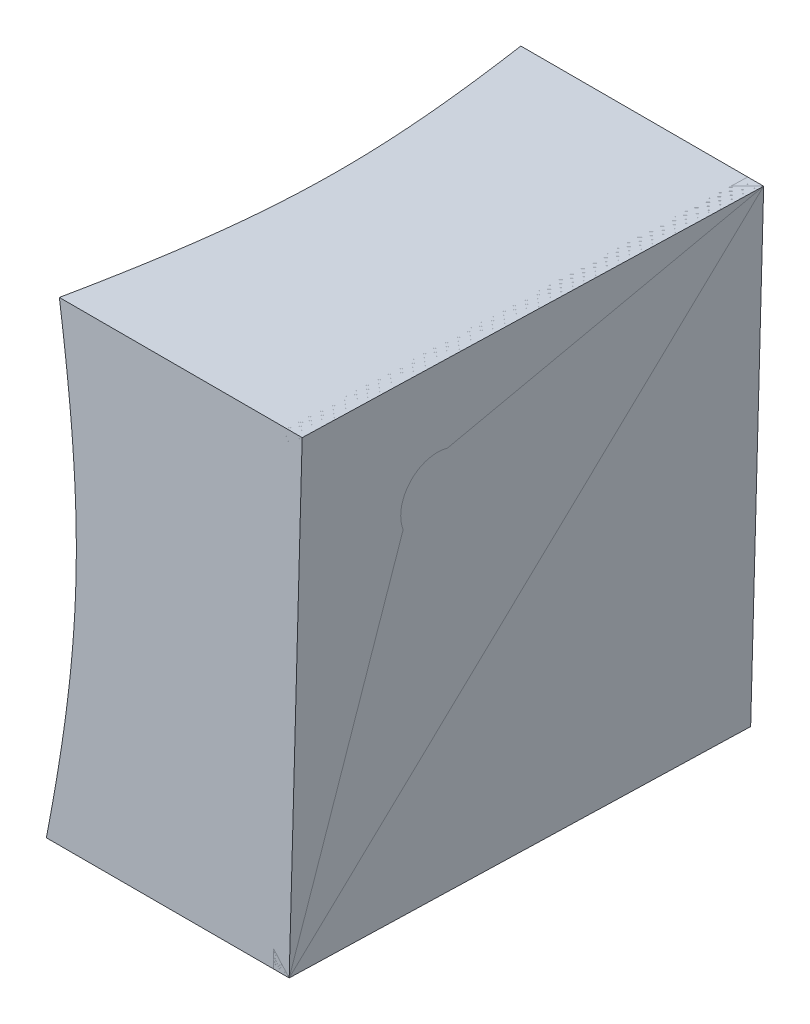
ISO-10303-21;
HEADER;
FILE_DESCRIPTION(('STEP AP214'),'2;1');
FILE_NAME('part.step','',(''),(''),'','','');
FILE_SCHEMA(('AUTOMOTIVE_DESIGN { 1 0 10303 214 1 1 1 1 }'));
ENDSEC;
DATA;
#1=APPLICATION_CONTEXT('core data for automotive mechanical design processes');
#2=APPLICATION_PROTOCOL_DEFINITION('international standard','automotive_design',2000,#1);
#3=PRODUCT_CONTEXT('',#1,'mechanical');
#4=PRODUCT('Part','Part','',(#3));
#5=PRODUCT_RELATED_PRODUCT_CATEGORY('part','',(#4));
#6=PRODUCT_DEFINITION_FORMATION('','',#4);
#7=PRODUCT_DEFINITION_CONTEXT('part definition',#1,'design');
#8=PRODUCT_DEFINITION('design','',#6,#7);
#9=PRODUCT_DEFINITION_SHAPE('','',#8);
#10=(LENGTH_UNIT() NAMED_UNIT(*) SI_UNIT(.MILLI.,.METRE.));
#11=(NAMED_UNIT(*) PLANE_ANGLE_UNIT() SI_UNIT($,.RADIAN.));
#12=(NAMED_UNIT(*) SI_UNIT($,.STERADIAN.) SOLID_ANGLE_UNIT());
#13=UNCERTAINTY_MEASURE_WITH_UNIT(LENGTH_MEASURE(1.E-05),#10,'distance_accuracy_value','');
#14=(GEOMETRIC_REPRESENTATION_CONTEXT(3) GLOBAL_UNCERTAINTY_ASSIGNED_CONTEXT((#13)) GLOBAL_UNIT_ASSIGNED_CONTEXT((#10,
#11,#12)) REPRESENTATION_CONTEXT('',''));
#15=CARTESIAN_POINT('',(0.,0.,0.));
#16=DIRECTION('',(0.,0.,1.));
#17=DIRECTION('',(1.,0.,0.));
#18=AXIS2_PLACEMENT_3D('',#15,#16,#17);
#19=CARTESIAN_POINT('',(-25.61,-22.248377411672,-21.0397546456181));
#20=DIRECTION('',(-1.,0.,0.));
#21=DIRECTION('',(0.,0.,1.));
#22=AXIS2_PLACEMENT_3D('',#19,#20,#21);
#23=CONICAL_SURFACE('',#22,29.,1.33394756584798);
#24=CARTESIAN_POINT('',(-21.1789920651224,-22.248377411672,-21.0397546456181));
#25=DIRECTION('',(-1.,0.,0.));
#26=DIRECTION('',(0.,0.,1.));
#27=AXIS2_PLACEMENT_3D('',#24,#25,#26);
#28=CIRCLE('',#27,10.6429671269357);
#29=CARTESIAN_POINT('',(-21.1789920651224,-22.248377411672,-10.3967875186824));
#30=VERTEX_POINT('',#29);
#31=EDGE_CURVE('E12',#30,#30,#28,.F.);
#32=ORIENTED_EDGE('',*,*,#31,.T.);
#33=EDGE_LOOP('',(#32));
#34=FACE_BOUND('',#33,.T.);
#35=CARTESIAN_POINT('',(-28.5095290864061,-50.420333833359,8.76548777946175));
#36=CARTESIAN_POINT('',(-28.3615120189373,-49.5533192105682,8.74105996271852));
#37=CARTESIAN_POINT('',(-28.2166725597,-48.6857525699901,8.71661659307804));
#38=CARTESIAN_POINT('',(-27.9344218695929,-46.9493810106497,8.66769496576661));
#39=CARTESIAN_POINT('',(-27.7970109167125,-46.0805760467939,8.64321670682519));
#40=CARTESIAN_POINT('',(-27.5306322784443,-44.3412065444453,8.59421061357687));
#41=CARTESIAN_POINT('',(-27.4016690184003,-43.4706413261291,8.56968276011622));
#42=CARTESIAN_POINT('',(-27.1535275015908,-41.7281219349922,8.52058791991479));
#43=CARTESIAN_POINT('',(-27.034349156175,-40.8561677748282,8.49602093353061));
#44=CARTESIAN_POINT('',(-26.8070554140274,-39.1099534307571,8.44682198939508));
#45=CARTESIAN_POINT('',(-26.6989508607805,-38.2356918304129,8.42218999173614));
#46=CARTESIAN_POINT('',(-26.4954430895225,-36.4856747589599,8.37288390716127));
#47=CARTESIAN_POINT('',(-26.4000400225253,-35.609919270215,8.34820981974844));
#48=CARTESIAN_POINT('',(-26.2235172089076,-33.8570926198621,8.29882457632585));
#49=CARTESIAN_POINT('',(-26.1423953660181,-32.9800216704369,8.27411342629425));
#50=CARTESIAN_POINT('',(-25.9959661704289,-31.2245756977996,8.22465438443381));
#51=CARTESIAN_POINT('',(-25.9306584035643,-30.3462007093461,8.19990649358427));
#52=CARTESIAN_POINT('',(-25.8179691541409,-28.5991859282428,8.15068499743102));
#53=CARTESIAN_POINT('',(-25.7703762731965,-27.7305598556457,8.12621177868473));
#54=CARTESIAN_POINT('',(-25.6931071834216,-25.9925067195989,8.07724277357074));
#55=CARTESIAN_POINT('',(-25.6634309447749,-25.1230796574847,8.05274698724067));
#56=CARTESIAN_POINT('',(-25.6227405676756,-23.3837759019233,8.0037427463838));
#57=CARTESIAN_POINT('',(-25.611726637473,-22.5138992035671,7.9792342917187));
#58=CARTESIAN_POINT('',(-25.6086490462998,-20.774112940722,7.93021645639734));
#59=CARTESIAN_POINT('',(-25.616585364688,-19.90420337627,7.90570707574212));
#60=CARTESIAN_POINT('',(-25.6511860596537,-18.1654805771054,7.85671920311714));
#61=CARTESIAN_POINT('',(-25.6778349183791,-17.2966670311303,7.83224070237767));
#62=CARTESIAN_POINT('',(-25.7491698861546,-15.5597813464223,7.78330458977393));
#63=CARTESIAN_POINT('',(-25.7938560930921,-14.6917092117386,7.75884697802373));
#64=CARTESIAN_POINT('',(-25.9002067407894,-12.956622360095,7.70996154687713));
#65=CARTESIAN_POINT('',(-25.961870998212,-12.0896076318182,7.68553372716187));
#66=CARTESIAN_POINT('',(-26.1008527747968,-10.3568322122462,7.63671341976009));
#67=CARTESIAN_POINT('',(-26.1781704302152,-9.49107153193292,7.61232093238299));
#68=CARTESIAN_POINT('',(-26.3285324181474,-7.95006618876275,7.56890367604869));
#69=CARTESIAN_POINT('',(-26.3988156007163,-7.27454974925753,7.5498712498848));
#70=CARTESIAN_POINT('',(-26.5473173293966,-5.92443325905969,7.51183221647334));
#71=CARTESIAN_POINT('',(-26.625535405659,-5.24983315650227,7.49282560776449));
#72=CARTESIAN_POINT('',(-26.8710401613971,-3.22719997339546,7.43583866494146));
#73=CARTESIAN_POINT('',(-27.0491636728229,-1.88047138809848,7.39789508449917));
#74=CARTESIAN_POINT('',(-27.3345557694149,0.140619093372598,7.34095160672489));
#75=CARTESIAN_POINT('',(-27.4330029283504,0.816253373573036,7.32191586044295));
#76=CARTESIAN_POINT('',(-27.6352741600994,2.16671936948047,7.28386697983721));
#77=CARTESIAN_POINT('',(-27.739098225591,2.84155108627906,7.26485384548267));
#78=CARTESIAN_POINT('',(-27.9515363580887,4.19024344984259,7.22685493631309));
#79=CARTESIAN_POINT('',(-28.0601489294023,4.86410433288063,7.20786915484115));
#80=CARTESIAN_POINT('',(-28.2817087806571,6.21110705670203,7.16991785064719));
#81=CARTESIAN_POINT('',(-28.3946560157991,6.88424890484283,7.15095232771789));
#82=CARTESIAN_POINT('',(-28.5095290864061,7.55705937848181,7.13199614114277));
#83=B_SPLINE_CURVE_WITH_KNOTS('',3,(#35,#36,#37,#38,#39,#40,#41,#42,#43,#44,#45,#46,#47,#48,#49,
#50,#51,#52,#53,#54,#55,#56,#57,#58,#59,#60,#61,#62,#63,#64,#65,#66,#67,#68,#69,#70,#71,#72,#73,
#74,#75,#76,#77,#78,#79,#80,#81,#82),.UNSPECIFIED.,.F.,.F.,(4,2,2,2,2,2,2,2,2,2,2,2,2,2,2,2,2,2,
2,2,2,2,2,4),(0.,2.63970211740469,5.2795029493581,7.92067576715604,10.5618246535933,
13.205535522218,15.8492778203558,18.4926317327186,21.1359164091373,23.7465614329058,
26.357202112124,28.9678719228976,31.5785388900533,34.1870434478219,36.7955621619664,
39.4040527091926,42.0125659631853,44.0508052270482,46.0889238709622,50.1655753856931,
52.2146650704377,54.2637519649559,56.3122032987129,58.3606334672046),.UNSPECIFIED.);
#84=CARTESIAN_POINT('',(-28.5094949366117,-50.420133833359,8.76548214453563));
#85=VERTEX_POINT('',#84);
#86=CARTESIAN_POINT('',(-28.5094949366117,7.5568593784818,7.13200177606889));
#87=VERTEX_POINT('',#86);
#88=EDGE_CURVE('E145',#85,#87,#83,.T.);
#89=ORIENTED_EDGE('',*,*,#88,.T.);
#90=CARTESIAN_POINT('',(-28.5095290864061,7.55686501340793,7.13220177606889));
#91=CARTESIAN_POINT('',(-28.3615120189373,7.5324371966647,6.26518715327807));
#92=CARTESIAN_POINT('',(-28.2166725597,7.50799382702421,5.39762051269999));
#93=CARTESIAN_POINT('',(-27.9344218695929,7.45907219971279,3.6612489533596));
#94=CARTESIAN_POINT('',(-27.7970109167125,7.43459394077136,2.79244398950379));
#95=CARTESIAN_POINT('',(-27.5306322784443,7.38558784752305,1.0530744871552));
#96=CARTESIAN_POINT('',(-27.4016690184003,7.36105999406239,0.182509268838954));
#97=CARTESIAN_POINT('',(-27.1535275015908,7.31196515386096,-1.56001012229793));
#98=CARTESIAN_POINT('',(-27.034349156175,7.28739816747679,-2.43196428246194));
#99=CARTESIAN_POINT('',(-26.8070554140274,7.23819922334126,-4.17817862653304));
#100=CARTESIAN_POINT('',(-26.6989508607805,7.21356722568232,-5.05244022687725));
#101=CARTESIAN_POINT('',(-26.4954430895225,7.16426114110744,-6.80245729833022));
#102=CARTESIAN_POINT('',(-26.4000400225253,7.13958705369461,-7.67821278707517));
#103=CARTESIAN_POINT('',(-26.2235172089076,7.09020181027202,-9.431039437428));
#104=CARTESIAN_POINT('',(-26.1423953660182,7.06549066024043,-10.3081103868532));
#105=CARTESIAN_POINT('',(-25.9959661704289,7.01603161837999,-12.0635563594905));
#106=CARTESIAN_POINT('',(-25.9306584035643,6.99128372753045,-12.941931347944));
#107=CARTESIAN_POINT('',(-25.8179691541409,6.9420622313772,-14.6889461290473));
#108=CARTESIAN_POINT('',(-25.7703762731965,6.91758901263091,-15.5575722016444));
#109=CARTESIAN_POINT('',(-25.6931071834216,6.86862000751692,-17.2956253376912));
#110=CARTESIAN_POINT('',(-25.6634309447749,6.84412422118684,-18.1650523998055));
#111=CARTESIAN_POINT('',(-25.6227405676756,6.79511998032998,-19.9043561553668));
#112=CARTESIAN_POINT('',(-25.611726637473,6.77061152566487,-20.774232853723));
#113=CARTESIAN_POINT('',(-25.6086490462998,6.72159369034351,-22.5140191165681));
#114=CARTESIAN_POINT('',(-25.616585364688,6.6970843096883,-23.3839286810201));
#115=CARTESIAN_POINT('',(-25.6511860596537,6.64809643706332,-25.1226514801848));
#116=CARTESIAN_POINT('',(-25.6778349183791,6.62361793632385,-25.9914650261598));
#117=CARTESIAN_POINT('',(-25.7491698861546,6.5746818237201,-27.7283507108678));
#118=CARTESIAN_POINT('',(-25.7938560930921,6.55022421196991,-28.5964228455515));
#119=CARTESIAN_POINT('',(-25.9002067407894,6.5013387808233,-30.3315096971951));
#120=CARTESIAN_POINT('',(-25.961870998212,6.47691096110804,-31.1985244254719));
#121=CARTESIAN_POINT('',(-26.1008527747968,6.42809065370627,-32.931299845044));
#122=CARTESIAN_POINT('',(-26.1781704302152,6.40369816632917,-33.7970605253572));
#123=CARTESIAN_POINT('',(-26.3285324181474,6.36028090999486,-35.3380658685274));
#124=CARTESIAN_POINT('',(-26.3988156007163,6.34124848383098,-36.0135823080326));
#125=CARTESIAN_POINT('',(-26.5473173293966,6.30320945041952,-37.3636987982304));
#126=CARTESIAN_POINT('',(-26.625535405659,6.28420284171066,-38.0382989007878));
#127=CARTESIAN_POINT('',(-26.8710401613971,6.22721589888763,-40.0609320838947));
#128=CARTESIAN_POINT('',(-27.0491636728229,6.18927231844534,-41.4076606691916));
#129=CARTESIAN_POINT('',(-27.3345557694149,6.13232884067107,-43.4287511506627));
#130=CARTESIAN_POINT('',(-27.4330029283504,6.11329309438912,-44.1043854308631));
#131=CARTESIAN_POINT('',(-27.6352741600994,6.07524421378339,-45.4548514267706));
#132=CARTESIAN_POINT('',(-27.739098225591,6.05623107942885,-46.1296831435692));
#133=CARTESIAN_POINT('',(-27.9515363580887,6.01823217025927,-47.4783755071327));
#134=CARTESIAN_POINT('',(-28.0601489294023,5.99924638878733,-48.1522363901707));
#135=CARTESIAN_POINT('',(-28.2817087806571,5.96129508459337,-49.4992391139921));
#136=CARTESIAN_POINT('',(-28.3946560157991,5.94232956166406,-50.1723809621329));
#137=CARTESIAN_POINT('',(-28.5095290864061,5.92337337508894,-50.8451914357719));
#138=B_SPLINE_CURVE_WITH_KNOTS('',3,(#90,#91,#92,#93,#94,#95,#96,#97,#98,#99,#100,#101,#102,
#103,#104,#105,#106,#107,#108,#109,#110,#111,#112,#113,#114,#115,#116,#117,#118,#119,#120,#121,
#122,#123,#124,#125,#126,#127,#128,#129,#130,#131,#132,#133,#134,#135,#136,#137),.UNSPECIFIED.,
.F.,.F.,(4,2,2,2,2,2,2,2,2,2,2,2,2,2,2,2,2,2,2,2,2,2,2,4),(0.,2.63970211740469,5.2795029493581,
7.92067576715604,10.5618246535933,13.205535522218,15.8492778203558,18.4926317327186,
21.1359164091373,23.7465614329058,26.357202112124,28.9678719228976,31.5785388900533,
34.1870434478219,36.7955621619664,39.4040527091926,42.0125659631852,44.0508052270482,
46.0889238709622,50.1655753856931,52.2146650704377,54.2637519649559,56.3122032987128,
58.3606334672046),.UNSPECIFIED.);
#139=CARTESIAN_POINT('',(-28.5094949366117,5.92337901001507,-50.8449914357719));
#140=VERTEX_POINT('',#139);
#141=EDGE_CURVE('E170',#87,#140,#138,.T.);
#142=ORIENTED_EDGE('',*,*,#141,.T.);
#143=CARTESIAN_POINT('',(-28.5095290864061,5.92357901001507,-50.844997070698));
#144=CARTESIAN_POINT('',(-28.3615120189373,5.05656438722425,-50.8205692539548));
#145=CARTESIAN_POINT('',(-28.2166725597,4.18899774664617,-50.7961258843143));
#146=CARTESIAN_POINT('',(-27.9344218695929,2.45262618730578,-50.7472042570029));
#147=CARTESIAN_POINT('',(-27.7970109167125,1.58382122344997,-50.7227259980615));
#148=CARTESIAN_POINT('',(-27.5306322784443,-0.155548278898622,-50.6737199048131));
#149=CARTESIAN_POINT('',(-27.4016690184003,-1.02611349721487,-50.6491920513525));
#150=CARTESIAN_POINT('',(-27.1535275015908,-2.76863288835175,-50.6000972111511));
#151=CARTESIAN_POINT('',(-27.034349156175,-3.64058704851576,-50.5755302247669));
#152=CARTESIAN_POINT('',(-26.8070554140274,-5.38680139258686,-50.5263312806314));
#153=CARTESIAN_POINT('',(-26.6989508607805,-6.26106299293107,-50.5016992829724));
#154=CARTESIAN_POINT('',(-26.4954430895225,-8.01108006438404,-50.4523931983975));
#155=CARTESIAN_POINT('',(-26.4000400225253,-8.88683555312898,-50.4277191109847));
#156=CARTESIAN_POINT('',(-26.2235172089076,-10.6396622034818,-50.3783338675621));
#157=CARTESIAN_POINT('',(-26.1423953660181,-11.516733152907,-50.3536227175305));
#158=CARTESIAN_POINT('',(-25.9959661704289,-13.2721791255443,-50.3041636756701));
#159=CARTESIAN_POINT('',(-25.9306584035643,-14.1505541139978,-50.2794157848206));
#160=CARTESIAN_POINT('',(-25.8179691541409,-15.8975688951011,-50.2301942886673));
#161=CARTESIAN_POINT('',(-25.7703762731965,-16.7661949676982,-50.205721069921));
#162=CARTESIAN_POINT('',(-25.6931071834216,-18.504248103745,-50.156752064807));
#163=CARTESIAN_POINT('',(-25.6634309447749,-19.3736751658593,-50.132256278477));
#164=CARTESIAN_POINT('',(-25.6227405676756,-21.1129789214207,-50.0832520376201));
#165=CARTESIAN_POINT('',(-25.611726637473,-21.9828556197768,-50.058743582955));
#166=CARTESIAN_POINT('',(-25.6086490462998,-23.7226418826219,-50.0097257476336));
#167=CARTESIAN_POINT('',(-25.616585364688,-24.5925514470739,-49.9852163669784));
#168=CARTESIAN_POINT('',(-25.6511860596537,-26.3312742462386,-49.9362284943534));
#169=CARTESIAN_POINT('',(-25.6778349183791,-27.2000877922136,-49.911749993614));
#170=CARTESIAN_POINT('',(-25.7491698861546,-28.9369734769216,-49.8628138810102));
#171=CARTESIAN_POINT('',(-25.7938560930921,-29.8050456116053,-49.83835626926));
#172=CARTESIAN_POINT('',(-25.9002067407894,-31.5401324632489,-49.7894708381134));
#173=CARTESIAN_POINT('',(-25.961870998212,-32.4071471915257,-49.7650430183981));
#174=CARTESIAN_POINT('',(-26.1008527747968,-34.1399226110978,-49.7162227109964));
#175=CARTESIAN_POINT('',(-26.1781704302152,-35.005683291411,-49.6918302236193));
#176=CARTESIAN_POINT('',(-26.3285324181474,-36.5466886345812,-49.648412967285));
#177=CARTESIAN_POINT('',(-26.3988156007163,-37.2222050740864,-49.6293805411211));
#178=CARTESIAN_POINT('',(-26.5473173293966,-38.5723215642843,-49.5913415077096));
#179=CARTESIAN_POINT('',(-26.625535405659,-39.2469216668417,-49.5723348990008));
#180=CARTESIAN_POINT('',(-26.8710401613971,-41.2695548499485,-49.5153479561777));
#181=CARTESIAN_POINT('',(-27.0491636728229,-42.6162834352455,-49.4774043757355));
#182=CARTESIAN_POINT('',(-27.3345557694149,-44.6373739167165,-49.4204608979612));
#183=CARTESIAN_POINT('',(-27.4330029283504,-45.313008196917,-49.4014251516792));
#184=CARTESIAN_POINT('',(-27.6352741600994,-46.6634741928244,-49.3633762710735));
#185=CARTESIAN_POINT('',(-27.739098225591,-47.338305909623,-49.344363136719));
#186=CARTESIAN_POINT('',(-27.9515363580887,-48.6869982731865,-49.3063642275494));
#187=CARTESIAN_POINT('',(-28.0601489294023,-49.3608591562246,-49.2873784460774));
#188=CARTESIAN_POINT('',(-28.2817087806571,-50.707861880046,-49.2494271418835));
#189=CARTESIAN_POINT('',(-28.3946560157991,-51.3810037281868,-49.2304616189542));
#190=CARTESIAN_POINT('',(-28.5095290864061,-52.0538142018258,-49.211505432379));
#191=B_SPLINE_CURVE_WITH_KNOTS('',3,(#143,#144,#145,#146,#147,#148,#149,#150,#151,#152,#153,
#154,#155,#156,#157,#158,#159,#160,#161,#162,#163,#164,#165,#166,#167,#168,#169,#170,#171,#172,
#173,#174,#175,#176,#177,#178,#179,#180,#181,#182,#183,#184,#185,#186,#187,#188,#189,#190),
.UNSPECIFIED.,.F.,.F.,(4,2,2,2,2,2,2,2,2,2,2,2,2,2,2,2,2,2,2,2,2,2,2,4),(0.,2.63970211740469,
5.2795029493581,7.92067576715603,10.5618246535933,13.205535522218,15.8492778203558,
18.4926317327186,21.1359164091373,23.7465614329058,26.357202112124,28.9678719228976,
31.5785388900533,34.1870434478218,36.7955621619664,39.4040527091926,42.0125659631852,
44.0508052270482,46.0889238709622,50.1655753856931,52.2146650704377,54.2637519649559,
56.3122032987129,58.3606334672046),.UNSPECIFIED.);
#192=CARTESIAN_POINT('',(-28.5094949366117,-52.0536142018258,-49.2115110673052));
#193=VERTEX_POINT('',#192);
#194=EDGE_CURVE('E178',#140,#193,#191,.T.);
#195=ORIENTED_EDGE('',*,*,#194,.T.);
#196=CARTESIAN_POINT('',(-28.5095290864061,-52.0536198367519,-49.2117110673052));
#197=CARTESIAN_POINT('',(-28.3615120189373,-52.0291920200087,-48.3446964445144));
#198=CARTESIAN_POINT('',(-28.2166725597,-52.0047486503682,-47.4771298039363));
#199=CARTESIAN_POINT('',(-27.9344218695929,-51.9558270230567,-45.7407582445959));
#200=CARTESIAN_POINT('',(-27.7970109167125,-51.9313487641153,-44.8719532807401));
#201=CARTESIAN_POINT('',(-27.5306322784443,-51.882342670867,-43.1325837783915));
#202=CARTESIAN_POINT('',(-27.4016690184003,-51.8578148174063,-42.2620185600752));
#203=CARTESIAN_POINT('',(-27.1535275015908,-51.8087199772049,-40.5194991689384));
#204=CARTESIAN_POINT('',(-27.034349156175,-51.7841529908207,-39.6475450087743));
#205=CARTESIAN_POINT('',(-26.8070554140274,-51.7349540466852,-37.9013306647032));
#206=CARTESIAN_POINT('',(-26.6989508607805,-51.7103220490263,-37.027069064359));
#207=CARTESIAN_POINT('',(-26.4954430895225,-51.6610159644514,-35.2770519929061));
#208=CARTESIAN_POINT('',(-26.4000400225253,-51.6363418770386,-34.4012965041611));
#209=CARTESIAN_POINT('',(-26.2235172089076,-51.586956633616,-32.6484698538083));
#210=CARTESIAN_POINT('',(-26.1423953660181,-51.5622454835844,-31.7713989043831));
#211=CARTESIAN_POINT('',(-25.9959661704289,-51.5127864417239,-30.0159529317458));
#212=CARTESIAN_POINT('',(-25.9306584035643,-51.4880385508744,-29.1375779432923));
#213=CARTESIAN_POINT('',(-25.8179691541409,-51.4388170547211,-27.390563162189));
#214=CARTESIAN_POINT('',(-25.7703762731965,-51.4143438359749,-26.5219370895919));
#215=CARTESIAN_POINT('',(-25.6931071834216,-51.3653748308609,-24.7838839535451));
#216=CARTESIAN_POINT('',(-25.6634309447749,-51.3408790445308,-23.9144568914308));
#217=CARTESIAN_POINT('',(-25.6227405676756,-51.2918748036739,-22.1751531358694));
#218=CARTESIAN_POINT('',(-25.611726637473,-51.2673663490088,-21.3052764375133));
#219=CARTESIAN_POINT('',(-25.6086490462998,-51.2183485136875,-19.5654901746682));
#220=CARTESIAN_POINT('',(-25.616585364688,-51.1938391330322,-18.6955806102162));
#221=CARTESIAN_POINT('',(-25.6511860596537,-51.1448512604073,-16.9568578110515));
#222=CARTESIAN_POINT('',(-25.6778349183791,-51.1203727596678,-16.0880442650765));
#223=CARTESIAN_POINT('',(-25.7491698861546,-51.0714366470641,-14.3511585803685));
#224=CARTESIAN_POINT('',(-25.7938560930921,-51.0469790353139,-13.4830864456848));
#225=CARTESIAN_POINT('',(-25.9002067407894,-50.9980936041673,-11.7479995940412));
#226=CARTESIAN_POINT('',(-25.961870998212,-50.973665784452,-10.8809848657644));
#227=CARTESIAN_POINT('',(-26.1008527747968,-50.9248454770502,-9.14820944619234));
#228=CARTESIAN_POINT('',(-26.1781704302152,-50.9004529896731,-8.28244876587909));
#229=CARTESIAN_POINT('',(-26.3285324181474,-50.8570357333388,-6.74144342270892));
#230=CARTESIAN_POINT('',(-26.3988156007163,-50.8380033071749,-6.0659269832037));
#231=CARTESIAN_POINT('',(-26.5473173293966,-50.7999642737635,-4.71581049300585));
#232=CARTESIAN_POINT('',(-26.625535405659,-50.7809576650546,-4.04121039044844));
#233=CARTESIAN_POINT('',(-26.8710401613971,-50.7239707222316,-2.01857720734163));
#234=CARTESIAN_POINT('',(-27.0491636728229,-50.6860271417893,-0.671848622044654));
#235=CARTESIAN_POINT('',(-27.3345557694149,-50.629083664015,1.34924185942642));
#236=CARTESIAN_POINT('',(-27.4330029283504,-50.6100479177331,2.02487613962686));
#237=CARTESIAN_POINT('',(-27.6352741600994,-50.5719990371273,3.37534213553429));
#238=CARTESIAN_POINT('',(-27.739098225591,-50.5529859027728,4.05017385233288));
#239=CARTESIAN_POINT('',(-27.9515363580887,-50.5149869936032,5.39886621589641));
#240=CARTESIAN_POINT('',(-28.0601489294023,-50.4960012121313,6.07272709893445));
#241=CARTESIAN_POINT('',(-28.2817087806571,-50.4580499079373,7.41972982275585));
#242=CARTESIAN_POINT('',(-28.3946560157991,-50.439084385008,8.09287167089666));
#243=CARTESIAN_POINT('',(-28.5095290864061,-50.4201281984329,8.76568214453563));
#244=B_SPLINE_CURVE_WITH_KNOTS('',3,(#196,#197,#198,#199,#200,#201,#202,#203,#204,#205,#206,
#207,#208,#209,#210,#211,#212,#213,#214,#215,#216,#217,#218,#219,#220,#221,#222,#223,#224,#225,
#226,#227,#228,#229,#230,#231,#232,#233,#234,#235,#236,#237,#238,#239,#240,#241,#242,#243),
.UNSPECIFIED.,.F.,.F.,(4,2,2,2,2,2,2,2,2,2,2,2,2,2,2,2,2,2,2,2,2,2,2,4),(0.,2.63970211740469,
5.2795029493581,7.92067576715603,10.5618246535933,13.205535522218,15.8492778203558,
18.4926317327186,21.1359164091373,23.7465614329058,26.357202112124,28.9678719228976,
31.5785388900533,34.1870434478218,36.7955621619664,39.4040527091926,42.0125659631852,
44.0508052270482,46.0889238709622,50.1655753856931,52.2146650704377,54.2637519649559,
56.3122032987129,58.3606334672046),.UNSPECIFIED.);
#245=EDGE_CURVE('E123',#193,#85,#244,.T.);
#246=ORIENTED_EDGE('',*,*,#245,.T.);
#247=EDGE_LOOP('',(#89,#142,#195,#246));
#248=FACE_BOUND('',#247,.T.);
#249=ADVANCED_FACE('F51',(#34,#248),#23,.F.);
#250=CARTESIAN_POINT('',(-18.61,-52.0536142018258,-49.2115110673052));
#251=DIRECTION('',(0.,0.999603331238634,-0.0281634546287368));
#252=DIRECTION('',(0.,0.0281634546287368,0.999603331238634));
#253=AXIS2_PLACEMENT_3D('',#250,#251,#252);
#254=PLANE('',#253);
#255=DIRECTION('',(1.,0.,0.));
#256=VECTOR('',#255,1.);
#257=CARTESIAN_POINT('',(-18.61,-52.0536142018258,-49.2115110673052));
#258=LINE('',#257,#256);
#259=CARTESIAN_POINT('',(2.,-52.0536142018258,-49.2115110673052));
#260=VERTEX_POINT('',#259);
#261=EDGE_CURVE('E117',#193,#260,#258,.T.);
#262=ORIENTED_EDGE('',*,*,#261,.T.);
#263=DIRECTION('',(0.,-0.0281634546287368,-0.999603331238634));
#264=VECTOR('',#263,1.);
#265=CARTESIAN_POINT('',(2.,-52.0536142018258,-49.2115110673052));
#266=LINE('',#265,#264);
#267=CARTESIAN_POINT('',(2.,-50.420133833359,8.76548214453563));
#268=VERTEX_POINT('',#267);
#269=EDGE_CURVE('E121',#268,#260,#266,.T.);
#270=ORIENTED_EDGE('',*,*,#269,.F.);
#271=DIRECTION('',(1.,0.,0.));
#272=VECTOR('',#271,1.);
#273=CARTESIAN_POINT('',(-18.61,-50.420133833359,8.76548214453563));
#274=LINE('',#273,#272);
#275=EDGE_CURVE('E217',#85,#268,#274,.T.);
#276=ORIENTED_EDGE('',*,*,#275,.F.);
#277=ORIENTED_EDGE('',*,*,#245,.F.);
#278=EDGE_LOOP('',(#262,#270,#276,#277));
#279=FACE_BOUND('',#278,.T.);
#280=ADVANCED_FACE('F119',(#279),#254,.F.);
#281=CARTESIAN_POINT('',(-18.61,-50.420133833359,8.76548214453563));
#282=DIRECTION('',(0.,-0.0281634546287368,-0.999603331238634));
#283=DIRECTION('',(0.,0.999603331238634,-0.0281634546287368));
#284=AXIS2_PLACEMENT_3D('',#281,#282,#283);
#285=PLANE('',#284);
#286=ORIENTED_EDGE('',*,*,#275,.T.);
#287=DIRECTION('',(0.,-0.999603331238634,0.0281634546287368));
#288=VECTOR('',#287,1.);
#289=CARTESIAN_POINT('',(2.,-50.420133833359,8.76548214453563));
#290=LINE('',#289,#288);
#291=CARTESIAN_POINT('',(2.,7.5568593784818,7.13200177606889));
#292=VERTEX_POINT('',#291);
#293=EDGE_CURVE('E140',#292,#268,#290,.T.);
#294=ORIENTED_EDGE('',*,*,#293,.F.);
#295=DIRECTION('',(1.,0.,0.));
#296=VECTOR('',#295,1.);
#297=CARTESIAN_POINT('',(-18.61,7.5568593784818,7.13200177606889));
#298=LINE('',#297,#296);
#299=EDGE_CURVE('E66',#87,#292,#298,.T.);
#300=ORIENTED_EDGE('',*,*,#299,.F.);
#301=ORIENTED_EDGE('',*,*,#88,.F.);
#302=EDGE_LOOP('',(#286,#294,#300,#301));
#303=FACE_BOUND('',#302,.T.);
#304=ADVANCED_FACE('F251',(#303),#285,.F.);
#305=CARTESIAN_POINT('',(-18.61,7.5568593784818,7.13200177606889));
#306=DIRECTION('',(0.,-0.999603331238634,0.0281634546287368));
#307=DIRECTION('',(0.,-0.0281634546287368,-0.999603331238634));
#308=AXIS2_PLACEMENT_3D('',#305,#306,#307);
#309=PLANE('',#308);
#310=ORIENTED_EDGE('',*,*,#299,.T.);
#311=DIRECTION('',(0.,0.0281634546287368,0.999603331238634));
#312=VECTOR('',#311,1.);
#313=CARTESIAN_POINT('',(2.,7.5568593784818,7.13200177606889));
#314=LINE('',#313,#312);
#315=CARTESIAN_POINT('',(2.,5.92337901001507,-50.8449914357719));
#316=VERTEX_POINT('',#315);
#317=EDGE_CURVE('E136',#316,#292,#314,.T.);
#318=ORIENTED_EDGE('',*,*,#317,.F.);
#319=DIRECTION('',(1.,0.,0.));
#320=VECTOR('',#319,1.);
#321=CARTESIAN_POINT('',(-18.61,5.92337901001507,-50.8449914357719));
#322=LINE('',#321,#320);
#323=EDGE_CURVE('E127',#140,#316,#322,.T.);
#324=ORIENTED_EDGE('',*,*,#323,.F.);
#325=ORIENTED_EDGE('',*,*,#141,.F.);
#326=EDGE_LOOP('',(#310,#318,#324,#325));
#327=FACE_BOUND('',#326,.T.);
#328=ADVANCED_FACE('F256',(#327),#309,.F.);
#329=CARTESIAN_POINT('',(-18.61,5.92337901001507,-50.8449914357719));
#330=DIRECTION('',(0.,0.0281634546287367,0.999603331238634));
#331=DIRECTION('',(0.,-0.999603331238634,0.0281634546287367));
#332=AXIS2_PLACEMENT_3D('',#329,#330,#331);
#333=PLANE('',#332);
#334=ORIENTED_EDGE('',*,*,#323,.T.);
#335=DIRECTION('',(0.,0.999603331238634,-0.0281634546287367));
#336=VECTOR('',#335,1.);
#337=CARTESIAN_POINT('',(2.,5.92337901001507,-50.8449914357719));
#338=LINE('',#337,#336);
#339=EDGE_CURVE('E131',#260,#316,#338,.T.);
#340=ORIENTED_EDGE('',*,*,#339,.F.);
#341=ORIENTED_EDGE('',*,*,#261,.F.);
#342=ORIENTED_EDGE('',*,*,#194,.F.);
#343=EDGE_LOOP('',(#334,#340,#341,#342));
#344=FACE_BOUND('',#343,.T.);
#345=ADVANCED_FACE('F132',(#344),#333,.F.);
#346=CARTESIAN_POINT('',(-18.61,5.50132580674706,5.1891220228491));
#347=DIRECTION('',(0.,-0.999603331238634,0.0281634546287368));
#348=DIRECTION('',(0.,-0.0281634546287368,-0.999603331238634));
#349=AXIS2_PLACEMENT_3D('',#346,#347,#348);
#350=PLANE('',#349);
#351=DIRECTION('',(0.,-0.0281634546287368,-0.999603331238634));
#352=VECTOR('',#351,1.);
#353=CARTESIAN_POINT('',(0.,5.50132580674706,5.1891220228491));
#354=LINE('',#353,#352);
#355=CARTESIAN_POINT('',(0.,5.50132580674706,5.1891220228491));
#356=VERTEX_POINT('',#355);
#357=CARTESIAN_POINT('',(0.,3.98049925679527,-48.7894578640372));
#358=VERTEX_POINT('',#357);
#359=EDGE_CURVE('E185',#356,#358,#354,.T.);
#360=ORIENTED_EDGE('',*,*,#359,.F.);
#361=DIRECTION('',(1.,0.,0.));
#362=VECTOR('',#361,1.);
#363=CARTESIAN_POINT('',(-18.61,5.50132580674706,5.1891220228491));
#364=LINE('',#363,#362);
#365=CARTESIAN_POINT('',(-18.61,5.50132580674706,5.1891220228491));
#366=VERTEX_POINT('',#365);
#367=EDGE_CURVE('E197',#366,#356,#364,.T.);
#368=ORIENTED_EDGE('',*,*,#367,.F.);
#369=DIRECTION('',(0.,-0.0281634546287368,-0.999603331238634));
#370=VECTOR('',#369,1.);
#371=CARTESIAN_POINT('',(-18.61,5.50132580674706,5.1891220228491));
#372=LINE('',#371,#370);
#373=CARTESIAN_POINT('',(-18.61,3.98049925679527,-48.7894578640372));
#374=VERTEX_POINT('',#373);
#375=EDGE_CURVE('E186',#366,#374,#372,.T.);
#376=ORIENTED_EDGE('',*,*,#375,.T.);
#377=DIRECTION('',(1.,0.,0.));
#378=VECTOR('',#377,1.);
#379=CARTESIAN_POINT('',(-18.61,3.98049925679527,-48.7894578640372));
#380=LINE('',#379,#378);
#381=EDGE_CURVE('E128',#374,#358,#380,.T.);
#382=ORIENTED_EDGE('',*,*,#381,.T.);
#383=EDGE_LOOP('',(#360,#368,#376,#382));
#384=FACE_BOUND('',#383,.T.);
#385=ADVANCED_FACE('F266',(#384),#350,.T.);
#386=CARTESIAN_POINT('',(-18.61,3.98049925679527,-48.7894578640372));
#387=DIRECTION('',(0.,0.0281634546287368,0.999603331238634));
#388=DIRECTION('',(0.,-0.999603331238634,0.0281634546287368));
#389=AXIS2_PLACEMENT_3D('',#386,#387,#388);
#390=PLANE('',#389);
#391=DIRECTION('',(0.,-0.999603331238634,0.0281634546287368));
#392=VECTOR('',#391,1.);
#393=CARTESIAN_POINT('',(0.,3.98049925679527,-48.7894578640372));
#394=LINE('',#393,#392);
#395=CARTESIAN_POINT('',(0.,-49.998080630091,-47.2686313140854));
#396=VERTEX_POINT('',#395);
#397=EDGE_CURVE('E200',#358,#396,#394,.T.);
#398=ORIENTED_EDGE('',*,*,#397,.F.);
#399=ORIENTED_EDGE('',*,*,#381,.F.);
#400=DIRECTION('',(0.,-0.999603331238634,0.0281634546287368));
#401=VECTOR('',#400,1.);
#402=CARTESIAN_POINT('',(-18.61,3.98049925679527,-48.7894578640372));
#403=LINE('',#402,#401);
#404=CARTESIAN_POINT('',(-18.61,-49.998080630091,-47.2686313140854));
#405=VERTEX_POINT('',#404);
#406=EDGE_CURVE('E189',#374,#405,#403,.T.);
#407=ORIENTED_EDGE('',*,*,#406,.T.);
#408=DIRECTION('',(1.,0.,0.));
#409=VECTOR('',#408,1.);
#410=CARTESIAN_POINT('',(-18.61,-49.998080630091,-47.2686313140854));
#411=LINE('',#410,#409);
#412=EDGE_CURVE('E211',#405,#396,#411,.T.);
#413=ORIENTED_EDGE('',*,*,#412,.T.);
#414=EDGE_LOOP('',(#398,#399,#407,#413));
#415=FACE_BOUND('',#414,.T.);
#416=ADVANCED_FACE('F269',(#415),#390,.T.);
#417=CARTESIAN_POINT('',(-18.61,-49.998080630091,-47.2686313140854));
#418=DIRECTION('',(0.,0.999603331238634,-0.028163454628737));
#419=DIRECTION('',(0.,0.028163454628737,0.999603331238634));
#420=AXIS2_PLACEMENT_3D('',#417,#418,#419);
#421=PLANE('',#420);
#422=DIRECTION('',(0.,0.028163454628737,0.999603331238634));
#423=VECTOR('',#422,1.);
#424=CARTESIAN_POINT('',(0.,-49.998080630091,-47.2686313140854));
#425=LINE('',#424,#423);
#426=CARTESIAN_POINT('',(0.,-48.4772540801392,6.70994857280088));
#427=VERTEX_POINT('',#426);
#428=EDGE_CURVE('E203',#396,#427,#425,.T.);
#429=ORIENTED_EDGE('',*,*,#428,.F.);
#430=ORIENTED_EDGE('',*,*,#412,.F.);
#431=DIRECTION('',(0.,0.028163454628737,0.999603331238634));
#432=VECTOR('',#431,1.);
#433=CARTESIAN_POINT('',(-18.61,-49.998080630091,-47.2686313140854));
#434=LINE('',#433,#432);
#435=CARTESIAN_POINT('',(-18.61,-48.4772540801392,6.70994857280088));
#436=VERTEX_POINT('',#435);
#437=EDGE_CURVE('E193',#405,#436,#434,.T.);
#438=ORIENTED_EDGE('',*,*,#437,.T.);
#439=DIRECTION('',(1.,0.,0.));
#440=VECTOR('',#439,1.);
#441=CARTESIAN_POINT('',(-18.61,-48.4772540801392,6.70994857280088));
#442=LINE('',#441,#440);
#443=EDGE_CURVE('E209',#436,#427,#442,.T.);
#444=ORIENTED_EDGE('',*,*,#443,.T.);
#445=EDGE_LOOP('',(#429,#430,#438,#444));
#446=FACE_BOUND('',#445,.T.);
#447=ADVANCED_FACE('F273',(#446),#421,.T.);
#448=CARTESIAN_POINT('',(-18.61,-48.4772540801392,6.70994857280088));
#449=DIRECTION('',(0.,-0.0281634546287368,-0.999603331238634));
#450=DIRECTION('',(0.,0.999603331238634,-0.0281634546287368));
#451=AXIS2_PLACEMENT_3D('',#448,#449,#450);
#452=PLANE('',#451);
#453=DIRECTION('',(0.,0.999603331238634,-0.0281634546287368));
#454=VECTOR('',#453,1.);
#455=CARTESIAN_POINT('',(0.,-48.4772540801392,6.70994857280088));
#456=LINE('',#455,#454);
#457=EDGE_CURVE('E190',#427,#356,#456,.T.);
#458=ORIENTED_EDGE('',*,*,#457,.F.);
#459=ORIENTED_EDGE('',*,*,#443,.F.);
#460=DIRECTION('',(0.,0.999603331238634,-0.0281634546287368));
#461=VECTOR('',#460,1.);
#462=CARTESIAN_POINT('',(-18.61,-48.4772540801392,6.70994857280088));
#463=LINE('',#462,#461);
#464=EDGE_CURVE('E74',#436,#366,#463,.T.);
#465=ORIENTED_EDGE('',*,*,#464,.T.);
#466=ORIENTED_EDGE('',*,*,#367,.T.);
#467=EDGE_LOOP('',(#458,#459,#465,#466));
#468=FACE_BOUND('',#467,.T.);
#469=ADVANCED_FACE('F276',(#468),#452,.T.);
#470=CARTESIAN_POINT('',(-18.61,-51.2368740175924,-20.2230144613848));
#471=DIRECTION('',(1.,0.,0.));
#472=DIRECTION('',(0.,0.,-1.));
#473=AXIS2_PLACEMENT_3D('',#470,#471,#472);
#474=PLANE('',#473);
#475=CARTESIAN_POINT('',(-18.61,-22.248377411672,-21.0397546456181));
#476=DIRECTION('',(1.,0.,0.));
#477=DIRECTION('',(0.,0.,-1.));
#478=AXIS2_PLACEMENT_3D('',#475,#476,#477);
#479=CIRCLE('',#478,6.);
#480=CARTESIAN_POINT('',(-18.61,-22.248377411672,-27.0397546456181));
#481=VERTEX_POINT('',#480);
#482=EDGE_CURVE('E177',#481,#481,#479,.T.);
#483=ORIENTED_EDGE('',*,*,#482,.F.);
#484=EDGE_LOOP('',(#483));
#485=FACE_BOUND('',#484,.T.);
#486=ORIENTED_EDGE('',*,*,#406,.F.);
#487=ORIENTED_EDGE('',*,*,#375,.F.);
#488=ORIENTED_EDGE('',*,*,#464,.F.);
#489=ORIENTED_EDGE('',*,*,#437,.F.);
#490=EDGE_LOOP('',(#486,#487,#488,#489));
#491=FACE_BOUND('',#490,.T.);
#492=ADVANCED_FACE('F168',(#485,#491),#474,.T.);
#493=CARTESIAN_POINT('',(2.,0.,0.));
#494=DIRECTION('',(-1.,0.,0.));
#495=DIRECTION('',(0.,0.,1.));
#496=AXIS2_PLACEMENT_3D('',#493,#494,#495);
#497=PLANE('',#496);
#498=CARTESIAN_POINT('',(2.,-7.13279623081204,-9.84503414650285));
#499=DIRECTION('',(-1.,0.,0.));
#500=DIRECTION('',(0.,0.,1.));
#501=AXIS2_PLACEMENT_3D('',#498,#499,#500);
#502=CIRCLE('',#501,4.6);
#503=CARTESIAN_POINT('',(2.,-7.13279623081204,-5.24503414650285));
#504=VERTEX_POINT('',#503);
#505=EDGE_CURVE('E225',#504,#504,#502,.T.);
#506=ORIENTED_EDGE('',*,*,#505,.T.);
#507=EDGE_LOOP('',(#506));
#508=FACE_BOUND('',#507,.T.);
#509=ORIENTED_EDGE('',*,*,#269,.T.);
#510=ORIENTED_EDGE('',*,*,#339,.T.);
#511=ORIENTED_EDGE('',*,*,#317,.T.);
#512=ORIENTED_EDGE('',*,*,#293,.T.);
#513=EDGE_LOOP('',(#509,#510,#511,#512));
#514=FACE_BOUND('',#513,.T.);
#515=ADVANCED_FACE('F139',(#508,#514),#497,.F.);
#516=CARTESIAN_POINT('',(0.,0.,0.));
#517=DIRECTION('',(-1.,0.,0.));
#518=DIRECTION('',(0.,0.,1.));
#519=AXIS2_PLACEMENT_3D('',#516,#517,#518);
#520=PLANE('',#519);
#521=CARTESIAN_POINT('',(0.,-7.13279623081204,-9.84503414650285));
#522=DIRECTION('',(-1.,0.,0.));
#523=DIRECTION('',(0.,0.,1.));
#524=AXIS2_PLACEMENT_3D('',#521,#522,#523);
#525=CIRCLE('',#524,4.6);
#526=CARTESIAN_POINT('',(0.,-7.13279623081204,-5.24503414650285));
#527=VERTEX_POINT('',#526);
#528=EDGE_CURVE('E59',#527,#527,#525,.F.);
#529=ORIENTED_EDGE('',*,*,#528,.T.);
#530=EDGE_LOOP('',(#529));
#531=FACE_BOUND('',#530,.T.);
#532=ORIENTED_EDGE('',*,*,#457,.T.);
#533=ORIENTED_EDGE('',*,*,#359,.T.);
#534=ORIENTED_EDGE('',*,*,#397,.T.);
#535=ORIENTED_EDGE('',*,*,#428,.T.);
#536=EDGE_LOOP('',(#532,#533,#534,#535));
#537=FACE_BOUND('',#536,.T.);
#538=ADVANCED_FACE('F230',(#531,#537),#520,.T.);
#539=CARTESIAN_POINT('',(2.,-7.13279623081204,-9.84503414650285));
#540=DIRECTION('',(-1.,0.,0.));
#541=DIRECTION('',(0.,0.,1.));
#542=AXIS2_PLACEMENT_3D('',#539,#540,#541);
#543=CYLINDRICAL_SURFACE('',#542,4.1);
#544=CARTESIAN_POINT('',(1.5,-7.13279623081204,-9.84503414650285));
#545=DIRECTION('',(-1.,0.,0.));
#546=DIRECTION('',(0.,0.,1.));
#547=AXIS2_PLACEMENT_3D('',#544,#545,#546);
#548=CIRCLE('',#547,4.1);
#549=CARTESIAN_POINT('',(1.5,-7.13279623081204,-5.74503414650285));
#550=VERTEX_POINT('',#549);
#551=EDGE_CURVE('E222',#550,#550,#548,.F.);
#552=ORIENTED_EDGE('',*,*,#551,.T.);
#553=EDGE_LOOP('',(#552));
#554=FACE_BOUND('',#553,.T.);
#555=CARTESIAN_POINT('',(0.5,-7.13279623081204,-9.84503414650285));
#556=DIRECTION('',(-1.,0.,0.));
#557=DIRECTION('',(0.,0.,1.));
#558=AXIS2_PLACEMENT_3D('',#555,#556,#557);
#559=CIRCLE('',#558,4.1);
#560=CARTESIAN_POINT('',(0.5,-7.13279623081204,-5.74503414650285));
#561=VERTEX_POINT('',#560);
#562=EDGE_CURVE('E219',#561,#561,#559,.T.);
#563=ORIENTED_EDGE('',*,*,#562,.T.);
#564=EDGE_LOOP('',(#563));
#565=FACE_BOUND('',#564,.T.);
#566=ADVANCED_FACE('F243',(#554,#565),#543,.F.);
#567=CARTESIAN_POINT('',(1.5,-7.13279623081204,-9.84503414650285));
#568=DIRECTION('',(-1.,0.,0.));
#569=DIRECTION('',(0.,0.,1.));
#570=AXIS2_PLACEMENT_3D('',#567,#568,#569);
#571=TOROIDAL_SURFACE('',#570,4.6,0.5);
#572=ORIENTED_EDGE('',*,*,#505,.F.);
#573=EDGE_LOOP('',(#572));
#574=FACE_BOUND('',#573,.T.);
#575=ORIENTED_EDGE('',*,*,#551,.F.);
#576=EDGE_LOOP('',(#575));
#577=FACE_BOUND('',#576,.T.);
#578=ADVANCED_FACE('F235',(#574,#577),#571,.T.);
#579=CARTESIAN_POINT('',(0.5,-7.13279623081204,-9.84503414650285));
#580=DIRECTION('',(-1.,0.,0.));
#581=DIRECTION('',(0.,0.,1.));
#582=AXIS2_PLACEMENT_3D('',#579,#580,#581);
#583=TOROIDAL_SURFACE('',#582,4.6,0.5);
#584=ORIENTED_EDGE('',*,*,#562,.F.);
#585=EDGE_LOOP('',(#584));
#586=FACE_BOUND('',#585,.T.);
#587=ORIENTED_EDGE('',*,*,#528,.F.);
#588=EDGE_LOOP('',(#587));
#589=FACE_BOUND('',#588,.T.);
#590=ADVANCED_FACE('F233',(#586,#589),#583,.T.);
#591=CARTESIAN_POINT('',(-11.4581699793895,-22.248377411672,-21.0397546456181));
#592=DIRECTION('',(1.,0.,0.));
#593=DIRECTION('',(0.,0.,-1.));
#594=AXIS2_PLACEMENT_3D('',#591,#592,#593);
#595=TOROIDAL_SURFACE('',#594,12.9893724579747,10.);
#596=ORIENTED_EDGE('',*,*,#482,.T.);
#597=EDGE_LOOP('',(#596));
#598=FACE_BOUND('',#597,.T.);
#599=ORIENTED_EDGE('',*,*,#31,.F.);
#600=EDGE_LOOP('',(#599));
#601=FACE_BOUND('',#600,.T.);
#602=ADVANCED_FACE('F53',(#598,#601),#595,.T.);
#603=CLOSED_SHELL('',(#249,#280,#304,#328,#345,#385,#416,#447,#469,#492,#515,#538,#566,#578,
#590,#602));
#604=MANIFOLD_SOLID_BREP('B2',#603);
#605=CARTESIAN_POINT('',(2.,-52.0536142018258,-49.2115110673052));
#606=DIRECTION('',(0.,0.0281634546287367,0.999603331238635));
#607=DIRECTION('',(0.,-0.999603331238635,0.0281634546287367));
#608=AXIS2_PLACEMENT_3D('',#605,#606,#607);
#609=PLANE('',#608);
#610=DIRECTION('',(0.,0.999603331238634,-0.0281634546287367));
#611=VECTOR('',#610,1.);
#612=CARTESIAN_POINT('',(0.,-52.0536142018258,-49.2115110673052));
#613=LINE('',#612,#611);
#614=CARTESIAN_POINT('',(0.,-52.0536142018258,-49.2115110673052));
#615=VERTEX_POINT('',#614);
#616=CARTESIAN_POINT('',(0.,5.92337901001507,-50.8449914357719));
#617=VERTEX_POINT('',#616);
#618=EDGE_CURVE('E492',#615,#617,#613,.T.);
#619=ORIENTED_EDGE('',*,*,#618,.T.);
#620=DIRECTION('',(-1.,0.,0.));
#621=VECTOR('',#620,1.);
#622=CARTESIAN_POINT('',(2.,5.92337901001507,-50.8449914357719));
#623=LINE('',#622,#621);
#624=CARTESIAN_POINT('',(2.,5.92337901001507,-50.8449914357719));
#625=VERTEX_POINT('',#624);
#626=EDGE_CURVE('E49',#625,#617,#623,.T.);
#627=ORIENTED_EDGE('',*,*,#626,.F.);
#628=DIRECTION('',(0.,0.999603331238634,-0.0281634546287367));
#629=VECTOR('',#628,1.);
#630=CARTESIAN_POINT('',(2.,-52.0536142018258,-49.2115110673052));
#631=LINE('',#630,#629);
#632=CARTESIAN_POINT('',(2.,-52.0536142018258,-49.2115110673052));
#633=VERTEX_POINT('',#632);
#634=EDGE_CURVE('E480',#633,#625,#631,.T.);
#635=ORIENTED_EDGE('',*,*,#634,.F.);
#636=DIRECTION('',(-1.,0.,0.));
#637=VECTOR('',#636,1.);
#638=CARTESIAN_POINT('',(2.,-52.0536142018258,-49.2115110673052));
#639=LINE('',#638,#637);
#640=EDGE_CURVE('E488',#633,#615,#639,.T.);
#641=ORIENTED_EDGE('',*,*,#640,.T.);
#642=EDGE_LOOP('',(#619,#627,#635,#641));
#643=FACE_BOUND('',#642,.T.);
#644=ADVANCED_FACE('F429',(#643),#609,.F.);
#645=CARTESIAN_POINT('',(2.,5.92337901001507,-50.8449914357719));
#646=DIRECTION('',(0.,-0.999603331238635,0.0281634546287368));
#647=DIRECTION('',(0.,-0.0281634546287368,-0.999603331238635));
#648=AXIS2_PLACEMENT_3D('',#645,#646,#647);
#649=PLANE('',#648);
#650=DIRECTION('',(0.,0.0281634546287368,0.999603331238634));
#651=VECTOR('',#650,1.);
#652=CARTESIAN_POINT('',(0.,5.92337901001507,-50.8449914357719));
#653=LINE('',#652,#651);
#654=CARTESIAN_POINT('',(0.,7.5568593784818,7.13200177606889));
#655=VERTEX_POINT('',#654);
#656=EDGE_CURVE('E484',#617,#655,#653,.T.);
#657=ORIENTED_EDGE('',*,*,#656,.T.);
#658=DIRECTION('',(-1.,0.,0.));
#659=VECTOR('',#658,1.);
#660=CARTESIAN_POINT('',(2.,7.5568593784818,7.13200177606889));
#661=LINE('',#660,#659);
#662=CARTESIAN_POINT('',(2.,7.5568593784818,7.13200177606889));
#663=VERTEX_POINT('',#662);
#664=EDGE_CURVE('E437',#663,#655,#661,.T.);
#665=ORIENTED_EDGE('',*,*,#664,.F.);
#666=DIRECTION('',(0.,0.0281634546287368,0.999603331238634));
#667=VECTOR('',#666,1.);
#668=CARTESIAN_POINT('',(2.,5.92337901001507,-50.8449914357719));
#669=LINE('',#668,#667);
#670=EDGE_CURVE('E475',#625,#663,#669,.T.);
#671=ORIENTED_EDGE('',*,*,#670,.F.);
#672=ORIENTED_EDGE('',*,*,#626,.T.);
#673=EDGE_LOOP('',(#657,#665,#671,#672));
#674=FACE_BOUND('',#673,.T.);
#675=ADVANCED_FACE('F483',(#674),#649,.F.);
#676=CARTESIAN_POINT('',(2.,7.5568593784818,7.13200177606889));
#677=DIRECTION('',(0.,-0.0281634546287368,-0.999603331238635));
#678=DIRECTION('',(0.,0.999603331238635,-0.0281634546287368));
#679=AXIS2_PLACEMENT_3D('',#676,#677,#678);
#680=PLANE('',#679);
#681=DIRECTION('',(0.,-0.999603331238634,0.0281634546287368));
#682=VECTOR('',#681,1.);
#683=CARTESIAN_POINT('',(0.,7.5568593784818,7.13200177606889));
#684=LINE('',#683,#682);
#685=CARTESIAN_POINT('',(0.,-50.420133833359,8.76548214453563));
#686=VERTEX_POINT('',#685);
#687=EDGE_CURVE('E462',#655,#686,#684,.T.);
#688=ORIENTED_EDGE('',*,*,#687,.T.);
#689=DIRECTION('',(-1.,0.,0.));
#690=VECTOR('',#689,1.);
#691=CARTESIAN_POINT('',(2.,-50.420133833359,8.76548214453563));
#692=LINE('',#691,#690);
#693=CARTESIAN_POINT('',(2.,-50.420133833359,8.76548214453563));
#694=VERTEX_POINT('',#693);
#695=EDGE_CURVE('E485',#694,#686,#692,.T.);
#696=ORIENTED_EDGE('',*,*,#695,.F.);
#697=DIRECTION('',(0.,-0.999603331238634,0.0281634546287368));
#698=VECTOR('',#697,1.);
#699=CARTESIAN_POINT('',(2.,7.5568593784818,7.13200177606889));
#700=LINE('',#699,#698);
#701=EDGE_CURVE('E478',#663,#694,#700,.T.);
#702=ORIENTED_EDGE('',*,*,#701,.F.);
#703=ORIENTED_EDGE('',*,*,#664,.T.);
#704=EDGE_LOOP('',(#688,#696,#702,#703));
#705=FACE_BOUND('',#704,.T.);
#706=ADVANCED_FACE('F486',(#705),#680,.F.);
#707=CARTESIAN_POINT('',(2.,-50.420133833359,8.76548214453563));
#708=DIRECTION('',(0.,0.999603331238635,-0.0281634546287368));
#709=DIRECTION('',(0.,0.0281634546287368,0.999603331238635));
#710=AXIS2_PLACEMENT_3D('',#707,#708,#709);
#711=PLANE('',#710);
#712=DIRECTION('',(0.,-0.0281634546287368,-0.999603331238634));
#713=VECTOR('',#712,1.);
#714=CARTESIAN_POINT('',(0.,-50.420133833359,8.76548214453563));
#715=LINE('',#714,#713);
#716=EDGE_CURVE('E468',#686,#615,#715,.T.);
#717=ORIENTED_EDGE('',*,*,#716,.T.);
#718=ORIENTED_EDGE('',*,*,#640,.F.);
#719=DIRECTION('',(0.,-0.0281634546287368,-0.999603331238634));
#720=VECTOR('',#719,1.);
#721=CARTESIAN_POINT('',(2.,-50.420133833359,8.76548214453563));
#722=LINE('',#721,#720);
#723=EDGE_CURVE('E445',#694,#633,#722,.T.);
#724=ORIENTED_EDGE('',*,*,#723,.F.);
#725=ORIENTED_EDGE('',*,*,#695,.T.);
#726=EDGE_LOOP('',(#717,#718,#724,#725));
#727=FACE_BOUND('',#726,.T.);
#728=ADVANCED_FACE('F499',(#727),#711,.F.);
#729=CARTESIAN_POINT('',(2.,0.,0.));
#730=DIRECTION('',(1.,0.,0.));
#731=DIRECTION('',(0.,0.,-1.));
#732=AXIS2_PLACEMENT_3D('',#729,#730,#731);
#733=PLANE('',#732);
#734=ORIENTED_EDGE('',*,*,#634,.T.);
#735=ORIENTED_EDGE('',*,*,#670,.T.);
#736=ORIENTED_EDGE('',*,*,#701,.T.);
#737=ORIENTED_EDGE('',*,*,#723,.T.);
#738=EDGE_LOOP('',(#734,#735,#736,#737));
#739=FACE_BOUND('',#738,.T.);
#740=ADVANCED_FACE('F476',(#739),#733,.T.);
#741=CARTESIAN_POINT('',(0.,0.,0.));
#742=DIRECTION('',(1.,0.,0.));
#743=DIRECTION('',(0.,0.,-1.));
#744=AXIS2_PLACEMENT_3D('',#741,#742,#743);
#745=PLANE('',#744);
#746=ORIENTED_EDGE('',*,*,#618,.F.);
#747=ORIENTED_EDGE('',*,*,#716,.F.);
#748=ORIENTED_EDGE('',*,*,#687,.F.);
#749=ORIENTED_EDGE('',*,*,#656,.F.);
#750=EDGE_LOOP('',(#746,#747,#748,#749));
#751=FACE_BOUND('',#750,.T.);
#752=ADVANCED_FACE('F502',(#751),#745,.F.);
#753=CLOSED_SHELL('',(#644,#675,#706,#728,#740,#752));
#754=MANIFOLD_SOLID_BREP('B6_NOT_SHOWN',#753);
#755=ADVANCED_BREP_SHAPE_REPRESENTATION('',(#18,#604,#754),#14);
#756=SHAPE_DEFINITION_REPRESENTATION(#9,#755);
ENDSEC;
END-ISO-10303-21;
